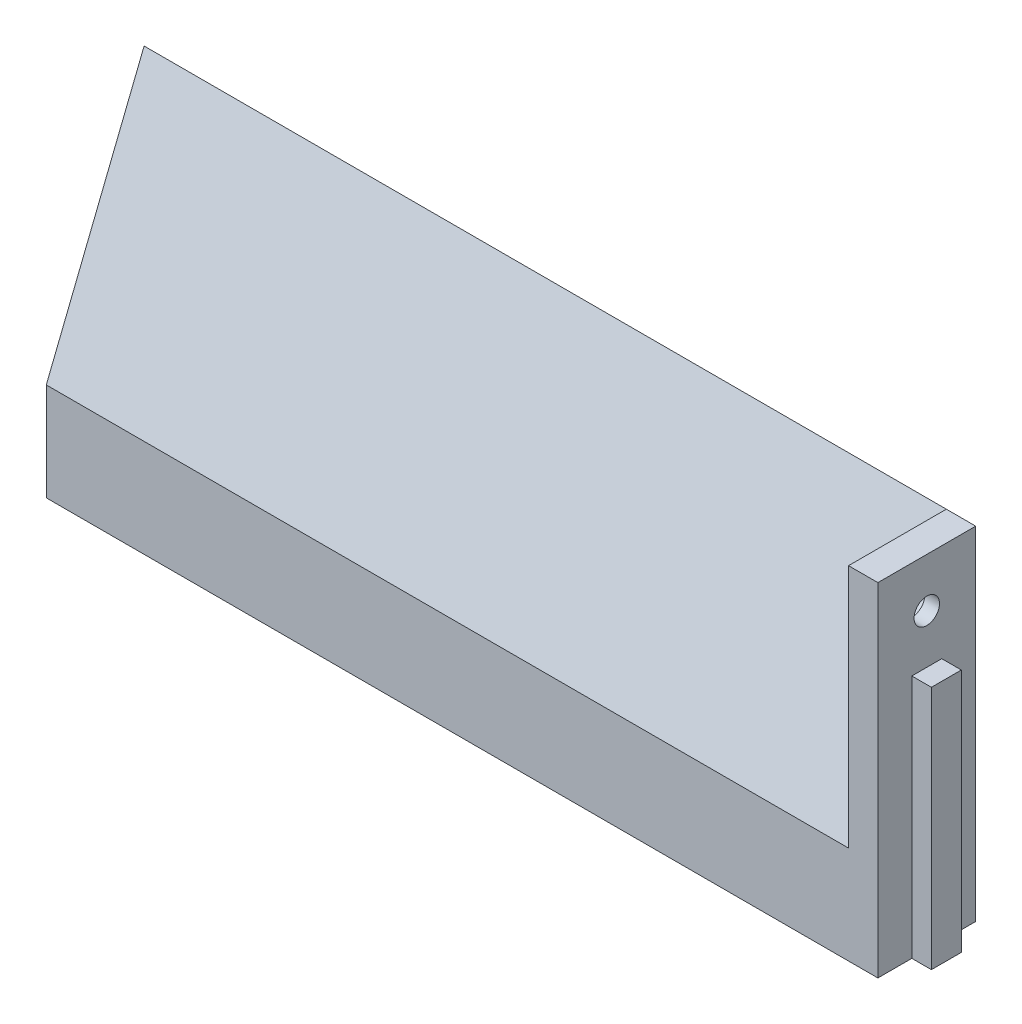
ISO-10303-21;
HEADER;
FILE_DESCRIPTION(('STEP AP214'),'2;1');
FILE_NAME('part.step','',(''),(''),'','','');
FILE_SCHEMA(('AUTOMOTIVE_DESIGN { 1 0 10303 214 1 1 1 1 }'));
ENDSEC;
DATA;
#1=APPLICATION_CONTEXT('core data for automotive mechanical design processes');
#2=APPLICATION_PROTOCOL_DEFINITION('international standard','automotive_design',2000,#1);
#3=PRODUCT_CONTEXT('',#1,'mechanical');
#4=PRODUCT('Part','Part','',(#3));
#5=PRODUCT_RELATED_PRODUCT_CATEGORY('part','',(#4));
#6=PRODUCT_DEFINITION_FORMATION('','',#4);
#7=PRODUCT_DEFINITION_CONTEXT('part definition',#1,'design');
#8=PRODUCT_DEFINITION('design','',#6,#7);
#9=PRODUCT_DEFINITION_SHAPE('','',#8);
#10=(LENGTH_UNIT() NAMED_UNIT(*) SI_UNIT(.MILLI.,.METRE.));
#11=(NAMED_UNIT(*) PLANE_ANGLE_UNIT() SI_UNIT($,.RADIAN.));
#12=(NAMED_UNIT(*) SI_UNIT($,.STERADIAN.) SOLID_ANGLE_UNIT());
#13=UNCERTAINTY_MEASURE_WITH_UNIT(LENGTH_MEASURE(1.E-05),#10,'distance_accuracy_value','');
#14=(GEOMETRIC_REPRESENTATION_CONTEXT(3) GLOBAL_UNCERTAINTY_ASSIGNED_CONTEXT((#13)) GLOBAL_UNIT_ASSIGNED_CONTEXT((#10,
#11,#12)) REPRESENTATION_CONTEXT('',''));
#15=CARTESIAN_POINT('',(0.,0.,0.));
#16=DIRECTION('',(0.,0.,1.));
#17=DIRECTION('',(1.,0.,0.));
#18=AXIS2_PLACEMENT_3D('',#15,#16,#17);
#19=CARTESIAN_POINT('',(0.,70.,0.));
#20=DIRECTION('',(0.,0.,-1.));
#21=DIRECTION('',(-1.,0.,0.));
#22=AXIS2_PLACEMENT_3D('',#19,#20,#21);
#23=PLANE('',#22);
#24=DIRECTION('',(0.,-1.,0.));
#25=VECTOR('',#24,1.);
#26=CARTESIAN_POINT('',(170.,200.,0.));
#27=LINE('',#26,#25);
#28=CARTESIAN_POINT('',(170.,20.,0.));
#29=VERTEX_POINT('',#28);
#30=CARTESIAN_POINT('',(170.,0.,0.));
#31=VERTEX_POINT('',#30);
#32=EDGE_CURVE('E55',#29,#31,#27,.T.);
#33=ORIENTED_EDGE('',*,*,#32,.T.);
#34=DIRECTION('',(1.,0.,0.));
#35=VECTOR('',#34,1.);
#36=CARTESIAN_POINT('',(0.,0.,0.));
#37=LINE('',#36,#35);
#38=CARTESIAN_POINT('',(340.,0.,0.));
#39=VERTEX_POINT('',#38);
#40=EDGE_CURVE('E123',#31,#39,#37,.T.);
#41=ORIENTED_EDGE('',*,*,#40,.T.);
#42=DIRECTION('',(0.,-1.,0.));
#43=VECTOR('',#42,1.);
#44=CARTESIAN_POINT('',(340.,70.,0.));
#45=LINE('',#44,#43);
#46=CARTESIAN_POINT('',(340.,70.,0.));
#47=VERTEX_POINT('',#46);
#48=EDGE_CURVE('E147',#47,#39,#45,.T.);
#49=ORIENTED_EDGE('',*,*,#48,.F.);
#50=DIRECTION('',(-1.,0.,0.));
#51=VECTOR('',#50,1.);
#52=CARTESIAN_POINT('',(340.,70.,0.));
#53=LINE('',#52,#51);
#54=CARTESIAN_POINT('',(334.,70.,0.));
#55=VERTEX_POINT('',#54);
#56=EDGE_CURVE('E150',#47,#55,#53,.T.);
#57=ORIENTED_EDGE('',*,*,#56,.T.);
#58=DIRECTION('',(0.,-1.,0.));
#59=VECTOR('',#58,1.);
#60=CARTESIAN_POINT('',(334.,0.,0.));
#61=LINE('',#60,#59);
#62=CARTESIAN_POINT('',(334.,20.,0.));
#63=VERTEX_POINT('',#62);
#64=EDGE_CURVE('E173',#55,#63,#61,.T.);
#65=ORIENTED_EDGE('',*,*,#64,.T.);
#66=DIRECTION('',(1.,0.,0.));
#67=VECTOR('',#66,1.);
#68=CARTESIAN_POINT('',(6.00000000000001,20.,0.));
#69=LINE('',#68,#67);
#70=EDGE_CURVE('E126',#29,#63,#69,.T.);
#71=ORIENTED_EDGE('',*,*,#70,.F.);
#72=EDGE_LOOP('',(#33,#41,#49,#57,#65,#71));
#73=FACE_BOUND('',#72,.T.);
#74=ADVANCED_FACE('F41',(#73),#23,.F.);
#75=CARTESIAN_POINT('',(0.,70.,-20.));
#76=DIRECTION('',(0.,0.,1.));
#77=DIRECTION('',(1.,0.,0.));
#78=AXIS2_PLACEMENT_3D('',#75,#76,#77);
#79=PLANE('',#78);
#80=DIRECTION('',(0.,-1.,0.));
#81=VECTOR('',#80,1.);
#82=CARTESIAN_POINT('',(170.,200.,-20.));
#83=LINE('',#82,#81);
#84=CARTESIAN_POINT('',(170.,70.,-20.));
#85=VERTEX_POINT('',#84);
#86=CARTESIAN_POINT('',(170.,0.,-20.));
#87=VERTEX_POINT('',#86);
#88=EDGE_CURVE('E115',#85,#87,#83,.T.);
#89=ORIENTED_EDGE('',*,*,#88,.F.);
#90=DIRECTION('',(-1.,0.,0.));
#91=VECTOR('',#90,1.);
#92=CARTESIAN_POINT('',(0.,70.,-20.));
#93=LINE('',#92,#91);
#94=CARTESIAN_POINT('',(334.,70.,-20.));
#95=VERTEX_POINT('',#94);
#96=EDGE_CURVE('E49',#95,#85,#93,.T.);
#97=ORIENTED_EDGE('',*,*,#96,.F.);
#98=DIRECTION('',(1.,0.,0.));
#99=VECTOR('',#98,1.);
#100=CARTESIAN_POINT('',(340.,70.,-20.));
#101=LINE('',#100,#99);
#102=CARTESIAN_POINT('',(340.,70.,-20.));
#103=VERTEX_POINT('',#102);
#104=EDGE_CURVE('E159',#95,#103,#101,.T.);
#105=ORIENTED_EDGE('',*,*,#104,.T.);
#106=DIRECTION('',(0.,-1.,0.));
#107=VECTOR('',#106,1.);
#108=CARTESIAN_POINT('',(340.,70.,-20.));
#109=LINE('',#108,#107);
#110=CARTESIAN_POINT('',(340.,0.,-20.));
#111=VERTEX_POINT('',#110);
#112=EDGE_CURVE('E138',#103,#111,#109,.T.);
#113=ORIENTED_EDGE('',*,*,#112,.T.);
#114=DIRECTION('',(-1.,0.,0.));
#115=VECTOR('',#114,1.);
#116=CARTESIAN_POINT('',(0.,0.,-20.));
#117=LINE('',#116,#115);
#118=EDGE_CURVE('E134',#111,#87,#117,.T.);
#119=ORIENTED_EDGE('',*,*,#118,.T.);
#120=EDGE_LOOP('',(#89,#97,#105,#113,#119));
#121=FACE_BOUND('',#120,.T.);
#122=ADVANCED_FACE('F247',(#121),#79,.F.);
#123=CARTESIAN_POINT('',(0.,0.,0.));
#124=DIRECTION('',(0.,-1.,0.));
#125=DIRECTION('',(0.,0.,-1.));
#126=AXIS2_PLACEMENT_3D('',#123,#124,#125);
#127=PLANE('',#126);
#128=ORIENTED_EDGE('',*,*,#40,.F.);
#129=DIRECTION('',(0.,0.,-1.));
#130=VECTOR('',#129,1.);
#131=CARTESIAN_POINT('',(170.,0.,0.));
#132=LINE('',#131,#130);
#133=EDGE_CURVE('E112',#31,#87,#132,.T.);
#134=ORIENTED_EDGE('',*,*,#133,.T.);
#135=ORIENTED_EDGE('',*,*,#118,.F.);
#136=DIRECTION('',(0.,0.,1.));
#137=VECTOR('',#136,1.);
#138=CARTESIAN_POINT('',(340.,0.,0.));
#139=LINE('',#138,#137);
#140=CARTESIAN_POINT('',(340.,0.,-13.06));
#141=VERTEX_POINT('',#140);
#142=EDGE_CURVE('E151',#111,#141,#139,.T.);
#143=ORIENTED_EDGE('',*,*,#142,.T.);
#144=DIRECTION('',(-1.,0.,0.));
#145=VECTOR('',#144,1.);
#146=CARTESIAN_POINT('',(344.,0.,-13.06));
#147=LINE('',#146,#145);
#148=CARTESIAN_POINT('',(344.,0.,-13.06));
#149=VERTEX_POINT('',#148);
#150=EDGE_CURVE('E199',#149,#141,#147,.T.);
#151=ORIENTED_EDGE('',*,*,#150,.F.);
#152=DIRECTION('',(0.,0.,1.));
#153=VECTOR('',#152,1.);
#154=CARTESIAN_POINT('',(344.,0.,0.));
#155=LINE('',#154,#153);
#156=CARTESIAN_POINT('',(344.,0.,-6.94));
#157=VERTEX_POINT('',#156);
#158=EDGE_CURVE('E220',#149,#157,#155,.T.);
#159=ORIENTED_EDGE('',*,*,#158,.T.);
#160=DIRECTION('',(-1.,0.,0.));
#161=VECTOR('',#160,1.);
#162=CARTESIAN_POINT('',(344.,0.,-6.94));
#163=LINE('',#162,#161);
#164=CARTESIAN_POINT('',(340.,0.,-6.94));
#165=VERTEX_POINT('',#164);
#166=EDGE_CURVE('E196',#157,#165,#163,.T.);
#167=ORIENTED_EDGE('',*,*,#166,.T.);
#168=EDGE_CURVE('E131',#165,#39,#139,.T.);
#169=ORIENTED_EDGE('',*,*,#168,.T.);
#170=EDGE_LOOP('',(#128,#134,#135,#143,#151,#159,#167,#169));
#171=FACE_BOUND('',#170,.T.);
#172=ADVANCED_FACE('F129',(#171),#127,.T.);
#173=CARTESIAN_POINT('',(6.00000000000001,2.75862068965517,6.89655172413793));
#174=DIRECTION('',(0.,-0.371390676354104,-0.928476690885259));
#175=DIRECTION('',(0.,0.928476690885259,-0.371390676354104));
#176=AXIS2_PLACEMENT_3D('',#173,#174,#175);
#177=PLANE('',#176);
#178=DIRECTION('',(0.,0.928476690885259,-0.371390676354104));
#179=VECTOR('',#178,1.);
#180=CARTESIAN_POINT('',(170.,2.75862068965517,6.89655172413793));
#181=LINE('',#180,#179);
#182=EDGE_CURVE('E11',#29,#85,#181,.T.);
#183=ORIENTED_EDGE('',*,*,#182,.F.);
#184=ORIENTED_EDGE('',*,*,#70,.T.);
#185=DIRECTION('',(0.,0.928476690885259,-0.371390676354104));
#186=VECTOR('',#185,1.);
#187=CARTESIAN_POINT('',(334.,2.75862068965517,6.89655172413793));
#188=LINE('',#187,#186);
#189=EDGE_CURVE('E165',#63,#95,#188,.T.);
#190=ORIENTED_EDGE('',*,*,#189,.T.);
#191=ORIENTED_EDGE('',*,*,#96,.T.);
#192=EDGE_LOOP('',(#183,#184,#190,#191));
#193=FACE_BOUND('',#192,.T.);
#194=ADVANCED_FACE('F273',(#193),#177,.F.);
#195=CARTESIAN_POINT('',(340.,70.,0.));
#196=DIRECTION('',(1.,0.,0.));
#197=DIRECTION('',(0.,0.,-1.));
#198=AXIS2_PLACEMENT_3D('',#195,#196,#197);
#199=PLANE('',#198);
#200=CARTESIAN_POINT('',(340.,60.,-10.));
#201=DIRECTION('',(1.,0.,0.));
#202=DIRECTION('',(0.,0.,-1.));
#203=AXIS2_PLACEMENT_3D('',#200,#201,#202);
#204=CIRCLE('',#203,2.6);
#205=CARTESIAN_POINT('',(340.,60.,-12.6));
#206=VERTEX_POINT('',#205);
#207=EDGE_CURVE('E181',#206,#206,#204,.T.);
#208=ORIENTED_EDGE('',*,*,#207,.F.);
#209=EDGE_LOOP('',(#208));
#210=FACE_BOUND('',#209,.T.);
#211=DIRECTION('',(0.,0.,-1.));
#212=VECTOR('',#211,1.);
#213=CARTESIAN_POINT('',(340.,50.,0.));
#214=LINE('',#213,#212);
#215=CARTESIAN_POINT('',(340.,50.,-6.94));
#216=VERTEX_POINT('',#215);
#217=CARTESIAN_POINT('',(340.,50.,-13.06));
#218=VERTEX_POINT('',#217);
#219=EDGE_CURVE('E63',#216,#218,#214,.T.);
#220=ORIENTED_EDGE('',*,*,#219,.T.);
#221=DIRECTION('',(0.,-1.,0.));
#222=VECTOR('',#221,1.);
#223=CARTESIAN_POINT('',(340.,0.,-13.06));
#224=LINE('',#223,#222);
#225=EDGE_CURVE('E207',#218,#141,#224,.T.);
#226=ORIENTED_EDGE('',*,*,#225,.T.);
#227=ORIENTED_EDGE('',*,*,#142,.F.);
#228=ORIENTED_EDGE('',*,*,#112,.F.);
#229=DIRECTION('',(0.,0.,1.));
#230=VECTOR('',#229,1.);
#231=CARTESIAN_POINT('',(340.,70.,0.));
#232=LINE('',#231,#230);
#233=EDGE_CURVE('E155',#103,#47,#232,.T.);
#234=ORIENTED_EDGE('',*,*,#233,.T.);
#235=ORIENTED_EDGE('',*,*,#48,.T.);
#236=ORIENTED_EDGE('',*,*,#168,.F.);
#237=DIRECTION('',(0.,-1.,0.));
#238=VECTOR('',#237,1.);
#239=CARTESIAN_POINT('',(340.,0.,-6.94));
#240=LINE('',#239,#238);
#241=EDGE_CURVE('E211',#216,#165,#240,.T.);
#242=ORIENTED_EDGE('',*,*,#241,.F.);
#243=EDGE_LOOP('',(#220,#226,#227,#228,#234,#235,#236,#242));
#244=FACE_BOUND('',#243,.T.);
#245=ADVANCED_FACE('F244',(#210,#244),#199,.T.);
#246=CARTESIAN_POINT('',(340.,70.,0.));
#247=DIRECTION('',(0.,-1.,0.));
#248=DIRECTION('',(0.,0.,-1.));
#249=AXIS2_PLACEMENT_3D('',#246,#247,#248);
#250=PLANE('',#249);
#251=DIRECTION('',(0.,0.,1.));
#252=VECTOR('',#251,1.);
#253=CARTESIAN_POINT('',(334.,70.,0.));
#254=LINE('',#253,#252);
#255=EDGE_CURVE('E169',#95,#55,#254,.T.);
#256=ORIENTED_EDGE('',*,*,#255,.T.);
#257=ORIENTED_EDGE('',*,*,#56,.F.);
#258=ORIENTED_EDGE('',*,*,#233,.F.);
#259=ORIENTED_EDGE('',*,*,#104,.F.);
#260=EDGE_LOOP('',(#256,#257,#258,#259));
#261=FACE_BOUND('',#260,.T.);
#262=ADVANCED_FACE('F252',(#261),#250,.F.);
#263=CARTESIAN_POINT('',(334.,0.,0.));
#264=DIRECTION('',(-1.,0.,0.));
#265=DIRECTION('',(0.,0.,-1.));
#266=AXIS2_PLACEMENT_3D('',#263,#264,#265);
#267=PLANE('',#266);
#268=CARTESIAN_POINT('',(334.,60.,-10.));
#269=DIRECTION('',(1.,0.,0.));
#270=DIRECTION('',(0.,0.,-1.));
#271=AXIS2_PLACEMENT_3D('',#268,#269,#270);
#272=CIRCLE('',#271,5.);
#273=CARTESIAN_POINT('',(334.,60.,-15.));
#274=VERTEX_POINT('',#273);
#275=EDGE_CURVE('E177',#274,#274,#272,.T.);
#276=ORIENTED_EDGE('',*,*,#275,.T.);
#277=EDGE_LOOP('',(#276));
#278=FACE_BOUND('',#277,.T.);
#279=ORIENTED_EDGE('',*,*,#64,.F.);
#280=ORIENTED_EDGE('',*,*,#255,.F.);
#281=ORIENTED_EDGE('',*,*,#189,.F.);
#282=EDGE_LOOP('',(#279,#280,#281));
#283=FACE_BOUND('',#282,.T.);
#284=ADVANCED_FACE('F284',(#278,#283),#267,.T.);
#285=CARTESIAN_POINT('',(337.,60.,-10.));
#286=DIRECTION('',(-1.,0.,0.));
#287=DIRECTION('',(0.,0.,1.));
#288=AXIS2_PLACEMENT_3D('',#285,#286,#287);
#289=CYLINDRICAL_SURFACE('',#288,5.);
#290=CARTESIAN_POINT('',(337.,60.,-10.));
#291=DIRECTION('',(1.,0.,0.));
#292=DIRECTION('',(0.,0.,-1.));
#293=AXIS2_PLACEMENT_3D('',#290,#291,#292);
#294=CIRCLE('',#293,5.);
#295=CARTESIAN_POINT('',(337.,60.,-15.));
#296=VERTEX_POINT('',#295);
#297=EDGE_CURVE('E176',#296,#296,#294,.T.);
#298=ORIENTED_EDGE('',*,*,#297,.T.);
#299=EDGE_LOOP('',(#298));
#300=FACE_BOUND('',#299,.T.);
#301=ORIENTED_EDGE('',*,*,#275,.F.);
#302=EDGE_LOOP('',(#301));
#303=FACE_BOUND('',#302,.T.);
#304=ADVANCED_FACE('F287',(#300,#303),#289,.F.);
#305=CARTESIAN_POINT('',(337.,0.,0.));
#306=DIRECTION('',(-1.,0.,0.));
#307=DIRECTION('',(0.,0.,-1.));
#308=AXIS2_PLACEMENT_3D('',#305,#306,#307);
#309=PLANE('',#308);
#310=CARTESIAN_POINT('',(337.,60.,-10.));
#311=DIRECTION('',(1.,0.,0.));
#312=DIRECTION('',(0.,0.,-1.));
#313=AXIS2_PLACEMENT_3D('',#310,#311,#312);
#314=CIRCLE('',#313,2.6);
#315=CARTESIAN_POINT('',(337.,60.,-12.6));
#316=VERTEX_POINT('',#315);
#317=EDGE_CURVE('E185',#316,#316,#314,.T.);
#318=ORIENTED_EDGE('',*,*,#317,.T.);
#319=EDGE_LOOP('',(#318));
#320=FACE_BOUND('',#319,.T.);
#321=ORIENTED_EDGE('',*,*,#297,.F.);
#322=EDGE_LOOP('',(#321));
#323=FACE_BOUND('',#322,.T.);
#324=ADVANCED_FACE('F291',(#320,#323),#309,.T.);
#325=CARTESIAN_POINT('',(340.,60.,-10.));
#326=DIRECTION('',(-1.,0.,0.));
#327=DIRECTION('',(0.,0.,1.));
#328=AXIS2_PLACEMENT_3D('',#325,#326,#327);
#329=CYLINDRICAL_SURFACE('',#328,2.6);
#330=ORIENTED_EDGE('',*,*,#207,.T.);
#331=EDGE_LOOP('',(#330));
#332=FACE_BOUND('',#331,.T.);
#333=ORIENTED_EDGE('',*,*,#317,.F.);
#334=EDGE_LOOP('',(#333));
#335=FACE_BOUND('',#334,.T.);
#336=ADVANCED_FACE('F264',(#332,#335),#329,.F.);
#337=CARTESIAN_POINT('',(344.,50.,0.));
#338=DIRECTION('',(0.,1.,0.));
#339=DIRECTION('',(0.,0.,1.));
#340=AXIS2_PLACEMENT_3D('',#337,#338,#339);
#341=PLANE('',#340);
#342=ORIENTED_EDGE('',*,*,#219,.F.);
#343=DIRECTION('',(-1.,0.,0.));
#344=VECTOR('',#343,1.);
#345=CARTESIAN_POINT('',(344.,50.,-6.94));
#346=LINE('',#345,#344);
#347=CARTESIAN_POINT('',(344.,50.,-6.94));
#348=VERTEX_POINT('',#347);
#349=EDGE_CURVE('E189',#348,#216,#346,.T.);
#350=ORIENTED_EDGE('',*,*,#349,.F.);
#351=DIRECTION('',(0.,0.,-1.));
#352=VECTOR('',#351,1.);
#353=CARTESIAN_POINT('',(344.,50.,0.));
#354=LINE('',#353,#352);
#355=CARTESIAN_POINT('',(344.,50.,-13.06));
#356=VERTEX_POINT('',#355);
#357=EDGE_CURVE('E210',#348,#356,#354,.T.);
#358=ORIENTED_EDGE('',*,*,#357,.T.);
#359=DIRECTION('',(-1.,0.,0.));
#360=VECTOR('',#359,1.);
#361=CARTESIAN_POINT('',(344.,50.,-13.06));
#362=LINE('',#361,#360);
#363=EDGE_CURVE('E203',#356,#218,#362,.T.);
#364=ORIENTED_EDGE('',*,*,#363,.T.);
#365=EDGE_LOOP('',(#342,#350,#358,#364));
#366=FACE_BOUND('',#365,.T.);
#367=ADVANCED_FACE('F235',(#366),#341,.T.);
#368=CARTESIAN_POINT('',(344.,0.,-6.94));
#369=DIRECTION('',(0.,0.,-1.));
#370=DIRECTION('',(-1.,0.,0.));
#371=AXIS2_PLACEMENT_3D('',#368,#369,#370);
#372=PLANE('',#371);
#373=ORIENTED_EDGE('',*,*,#241,.T.);
#374=ORIENTED_EDGE('',*,*,#166,.F.);
#375=DIRECTION('',(0.,-1.,0.));
#376=VECTOR('',#375,1.);
#377=CARTESIAN_POINT('',(344.,0.,-6.94));
#378=LINE('',#377,#376);
#379=EDGE_CURVE('E224',#348,#157,#378,.T.);
#380=ORIENTED_EDGE('',*,*,#379,.F.);
#381=ORIENTED_EDGE('',*,*,#349,.T.);
#382=EDGE_LOOP('',(#373,#374,#380,#381));
#383=FACE_BOUND('',#382,.T.);
#384=ADVANCED_FACE('F256',(#383),#372,.F.);
#385=CARTESIAN_POINT('',(344.,0.,-13.06));
#386=DIRECTION('',(0.,0.,-1.));
#387=DIRECTION('',(-1.,0.,0.));
#388=AXIS2_PLACEMENT_3D('',#385,#386,#387);
#389=PLANE('',#388);
#390=ORIENTED_EDGE('',*,*,#225,.F.);
#391=ORIENTED_EDGE('',*,*,#363,.F.);
#392=DIRECTION('',(0.,-1.,0.));
#393=VECTOR('',#392,1.);
#394=CARTESIAN_POINT('',(344.,0.,-13.06));
#395=LINE('',#394,#393);
#396=EDGE_CURVE('E206',#356,#149,#395,.T.);
#397=ORIENTED_EDGE('',*,*,#396,.T.);
#398=ORIENTED_EDGE('',*,*,#150,.T.);
#399=EDGE_LOOP('',(#390,#391,#397,#398));
#400=FACE_BOUND('',#399,.T.);
#401=ADVANCED_FACE('F242',(#400),#389,.T.);
#402=CARTESIAN_POINT('',(344.,0.,0.));
#403=DIRECTION('',(1.,0.,0.));
#404=DIRECTION('',(0.,0.,1.));
#405=AXIS2_PLACEMENT_3D('',#402,#403,#404);
#406=PLANE('',#405);
#407=ORIENTED_EDGE('',*,*,#357,.F.);
#408=ORIENTED_EDGE('',*,*,#379,.T.);
#409=ORIENTED_EDGE('',*,*,#158,.F.);
#410=ORIENTED_EDGE('',*,*,#396,.F.);
#411=EDGE_LOOP('',(#407,#408,#409,#410));
#412=FACE_BOUND('',#411,.T.);
#413=ADVANCED_FACE('F240',(#412),#406,.T.);
#414=CARTESIAN_POINT('',(170.,200.,0.));
#415=DIRECTION('',(-1.,0.,0.));
#416=DIRECTION('',(0.,0.,1.));
#417=AXIS2_PLACEMENT_3D('',#414,#415,#416);
#418=PLANE('',#417);
#419=ORIENTED_EDGE('',*,*,#182,.T.);
#420=ORIENTED_EDGE('',*,*,#88,.T.);
#421=ORIENTED_EDGE('',*,*,#133,.F.);
#422=ORIENTED_EDGE('',*,*,#32,.F.);
#423=EDGE_LOOP('',(#419,#420,#421,#422));
#424=FACE_BOUND('',#423,.T.);
#425=ADVANCED_FACE('F113',(#424),#418,.T.);
#426=CLOSED_SHELL('',(#74,#122,#172,#194,#245,#262,#284,#304,#324,#336,#367,#384,#401,#413,#425));
#427=MANIFOLD_SOLID_BREP('B2',#426);
#428=ADVANCED_BREP_SHAPE_REPRESENTATION('',(#18,#427),#14);
#429=SHAPE_DEFINITION_REPRESENTATION(#9,#428);
ENDSEC;
END-ISO-10303-21;
